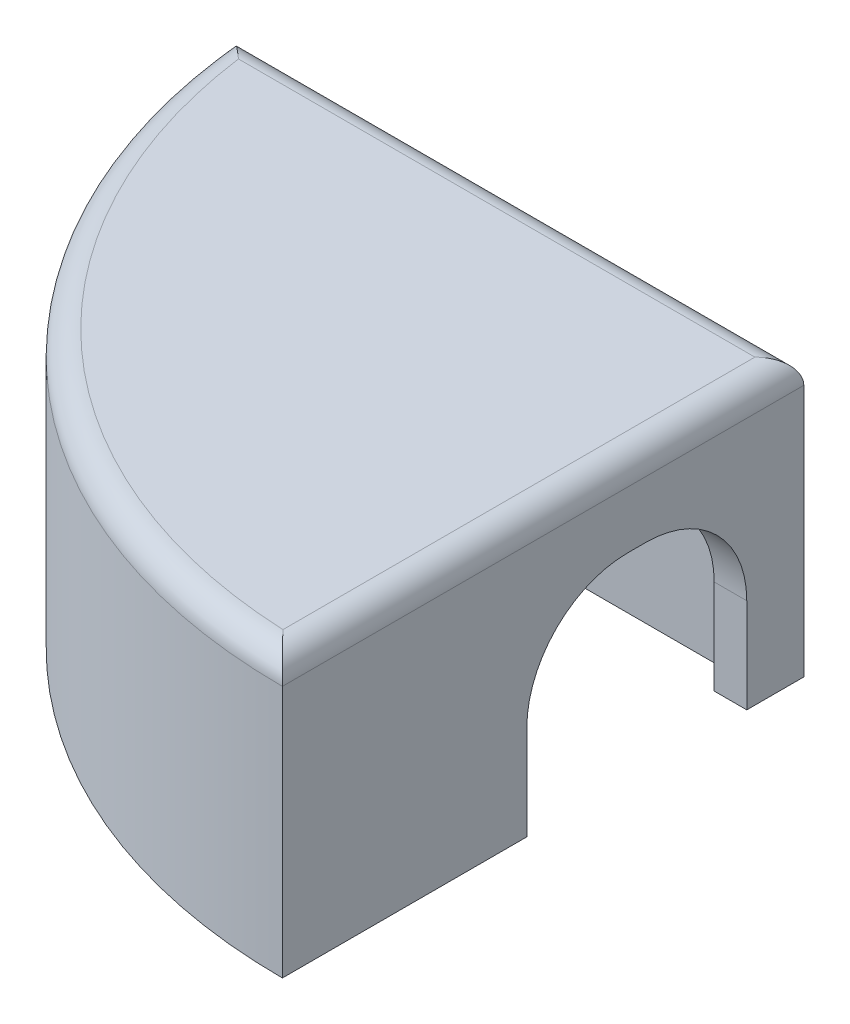
ISO-10303-21;
HEADER;
FILE_DESCRIPTION(('STEP AP214'),'2;1');
FILE_NAME('part.step','',(''),(''),'','','');
FILE_SCHEMA(('AUTOMOTIVE_DESIGN { 1 0 10303 214 1 1 1 1 }'));
ENDSEC;
DATA;
#1=APPLICATION_CONTEXT('core data for automotive mechanical design processes');
#2=APPLICATION_PROTOCOL_DEFINITION('international standard','automotive_design',2000,#1);
#3=PRODUCT_CONTEXT('',#1,'mechanical');
#4=PRODUCT('Part','Part','',(#3));
#5=PRODUCT_RELATED_PRODUCT_CATEGORY('part','',(#4));
#6=PRODUCT_DEFINITION_FORMATION('','',#4);
#7=PRODUCT_DEFINITION_CONTEXT('part definition',#1,'design');
#8=PRODUCT_DEFINITION('design','',#6,#7);
#9=PRODUCT_DEFINITION_SHAPE('','',#8);
#10=(LENGTH_UNIT() NAMED_UNIT(*) SI_UNIT(.MILLI.,.METRE.));
#11=(NAMED_UNIT(*) PLANE_ANGLE_UNIT() SI_UNIT($,.RADIAN.));
#12=(NAMED_UNIT(*) SI_UNIT($,.STERADIAN.) SOLID_ANGLE_UNIT());
#13=UNCERTAINTY_MEASURE_WITH_UNIT(LENGTH_MEASURE(1.E-05),#10,'distance_accuracy_value','');
#14=(GEOMETRIC_REPRESENTATION_CONTEXT(3) GLOBAL_UNCERTAINTY_ASSIGNED_CONTEXT((#13)) GLOBAL_UNIT_ASSIGNED_CONTEXT((#10,
#11,#12)) REPRESENTATION_CONTEXT('',''));
#15=CARTESIAN_POINT('',(0.,0.,0.));
#16=DIRECTION('',(0.,0.,1.));
#17=DIRECTION('',(1.,0.,0.));
#18=AXIS2_PLACEMENT_3D('',#15,#16,#17);
#19=CARTESIAN_POINT('',(-60.,0.,0.));
#20=DIRECTION('',(0.,1.,0.));
#21=DIRECTION('',(0.,0.,1.));
#22=AXIS2_PLACEMENT_3D('',#19,#20,#21);
#23=PLANE('',#22);
#24=DIRECTION('',(0.,0.,-1.));
#25=VECTOR('',#24,1.);
#26=CARTESIAN_POINT('',(-60.,0.,35.));
#27=LINE('',#26,#25);
#28=CARTESIAN_POINT('',(-60.,0.,6.5));
#29=VERTEX_POINT('',#28);
#30=CARTESIAN_POINT('',(-60.,0.,3.));
#31=VERTEX_POINT('',#30);
#32=EDGE_CURVE('E158',#29,#31,#27,.T.);
#33=ORIENTED_EDGE('',*,*,#32,.F.);
#34=DIRECTION('',(1.,0.,0.));
#35=VECTOR('',#34,1.);
#36=CARTESIAN_POINT('',(-65.,0.,6.5));
#37=LINE('',#36,#35);
#38=CARTESIAN_POINT('',(-62.,0.,6.5));
#39=VERTEX_POINT('',#38);
#40=EDGE_CURVE('E151',#39,#29,#37,.T.);
#41=ORIENTED_EDGE('',*,*,#40,.F.);
#42=DIRECTION('',(0.,0.,-1.));
#43=VECTOR('',#42,1.);
#44=CARTESIAN_POINT('',(-62.,0.,5.00000000000001));
#45=LINE('',#44,#43);
#46=CARTESIAN_POINT('',(-62.,0.,5.00000000000001));
#47=VERTEX_POINT('',#46);
#48=EDGE_CURVE('E262',#39,#47,#45,.T.);
#49=ORIENTED_EDGE('',*,*,#48,.T.);
#50=DIRECTION('',(-1.,0.,0.));
#51=VECTOR('',#50,1.);
#52=CARTESIAN_POINT('',(-62.,0.,5.00000000000001));
#53=LINE('',#52,#51);
#54=CARTESIAN_POINT('',(-93.1247641501038,0.,5.00000000000001));
#55=VERTEX_POINT('',#54);
#56=EDGE_CURVE('E297',#47,#55,#53,.T.);
#57=ORIENTED_EDGE('',*,*,#56,.T.);
#58=CARTESIAN_POINT('',(-60.,0.,0.));
#59=DIRECTION('',(0.,1.,0.));
#60=DIRECTION('',(0.,0.,1.));
#61=AXIS2_PLACEMENT_3D('',#58,#59,#60);
#62=CIRCLE('',#61,33.5);
#63=CARTESIAN_POINT('',(-62.,0.,33.4402452144119));
#64=VERTEX_POINT('',#63);
#65=EDGE_CURVE('E261',#55,#64,#62,.T.);
#66=ORIENTED_EDGE('',*,*,#65,.T.);
#67=CARTESIAN_POINT('',(-62.,0.,20.));
#68=VERTEX_POINT('',#67);
#69=EDGE_CURVE('E150',#64,#68,#45,.T.);
#70=ORIENTED_EDGE('',*,*,#69,.T.);
#71=DIRECTION('',(1.,0.,0.));
#72=VECTOR('',#71,1.);
#73=CARTESIAN_POINT('',(-65.,0.,20.));
#74=LINE('',#73,#72);
#75=CARTESIAN_POINT('',(-60.,0.,20.));
#76=VERTEX_POINT('',#75);
#77=EDGE_CURVE('E135',#68,#76,#74,.T.);
#78=ORIENTED_EDGE('',*,*,#77,.T.);
#79=CARTESIAN_POINT('',(-60.,0.,35.));
#80=VERTEX_POINT('',#79);
#81=EDGE_CURVE('E148',#80,#76,#27,.T.);
#82=ORIENTED_EDGE('',*,*,#81,.F.);
#83=CARTESIAN_POINT('',(-60.,0.,0.));
#84=DIRECTION('',(0.,1.,0.));
#85=DIRECTION('',(0.,0.,1.));
#86=AXIS2_PLACEMENT_3D('',#83,#84,#85);
#87=CIRCLE('',#86,35.);
#88=CARTESIAN_POINT('',(-94.8711915483254,0.,3.));
#89=VERTEX_POINT('',#88);
#90=EDGE_CURVE('E161',#89,#80,#87,.T.);
#91=ORIENTED_EDGE('',*,*,#90,.F.);
#92=DIRECTION('',(-1.,0.,0.));
#93=VECTOR('',#92,1.);
#94=CARTESIAN_POINT('',(-60.,0.,3.));
#95=LINE('',#94,#93);
#96=EDGE_CURVE('E157',#31,#89,#95,.T.);
#97=ORIENTED_EDGE('',*,*,#96,.F.);
#98=EDGE_LOOP('',(#33,#41,#49,#57,#66,#70,#78,#82,#91,#97));
#99=FACE_BOUND('',#98,.T.);
#100=ADVANCED_FACE('F34',(#99),#23,.F.);
#101=CARTESIAN_POINT('',(-60.,15.,35.));
#102=DIRECTION('',(-1.,0.,0.));
#103=DIRECTION('',(0.,0.,1.));
#104=AXIS2_PLACEMENT_3D('',#101,#102,#103);
#105=PLANE('',#104);
#106=DIRECTION('',(0.,0.,1.));
#107=VECTOR('',#106,1.);
#108=CARTESIAN_POINT('',(-60.,12.,0.));
#109=LINE('',#108,#107);
#110=CARTESIAN_POINT('',(-60.,12.,12.7));
#111=VERTEX_POINT('',#110);
#112=CARTESIAN_POINT('',(-60.,12.,13.8));
#113=VERTEX_POINT('',#112);
#114=EDGE_CURVE('E141',#111,#113,#109,.T.);
#115=ORIENTED_EDGE('',*,*,#114,.F.);
#116=CARTESIAN_POINT('',(-60.,5.8,12.7));
#117=DIRECTION('',(-1.,0.,0.));
#118=DIRECTION('',(0.,0.,1.));
#119=AXIS2_PLACEMENT_3D('',#116,#117,#118);
#120=CIRCLE('',#119,6.2);
#121=CARTESIAN_POINT('',(-60.,5.8,6.5));
#122=VERTEX_POINT('',#121);
#123=EDGE_CURVE('E42',#111,#122,#120,.T.);
#124=ORIENTED_EDGE('',*,*,#123,.T.);
#125=DIRECTION('',(0.,1.,0.));
#126=VECTOR('',#125,1.);
#127=CARTESIAN_POINT('',(-60.,0.,6.5));
#128=LINE('',#127,#126);
#129=EDGE_CURVE('E140',#29,#122,#128,.T.);
#130=ORIENTED_EDGE('',*,*,#129,.F.);
#131=ORIENTED_EDGE('',*,*,#32,.T.);
#132=DIRECTION('',(0.,-1.,0.));
#133=VECTOR('',#132,1.);
#134=CARTESIAN_POINT('',(-60.,15.,3.));
#135=LINE('',#134,#133);
#136=CARTESIAN_POINT('',(-60.,15.5,3.));
#137=VERTEX_POINT('',#136);
#138=EDGE_CURVE('E171',#137,#31,#135,.T.);
#139=ORIENTED_EDGE('',*,*,#138,.F.);
#140=DIRECTION('',(0.,0.,-1.));
#141=VECTOR('',#140,1.);
#142=CARTESIAN_POINT('',(-60.,15.5,35.));
#143=LINE('',#142,#141);
#144=CARTESIAN_POINT('',(-60.,15.5,35.));
#145=VERTEX_POINT('',#144);
#146=EDGE_CURVE('E186',#137,#145,#143,.F.);
#147=ORIENTED_EDGE('',*,*,#146,.T.);
#148=DIRECTION('',(0.,-1.,0.));
#149=VECTOR('',#148,1.);
#150=CARTESIAN_POINT('',(-60.,15.,35.));
#151=LINE('',#150,#149);
#152=EDGE_CURVE('E155',#145,#80,#151,.T.);
#153=ORIENTED_EDGE('',*,*,#152,.T.);
#154=ORIENTED_EDGE('',*,*,#81,.T.);
#155=DIRECTION('',(0.,-1.,0.));
#156=VECTOR('',#155,1.);
#157=CARTESIAN_POINT('',(-60.,0.,20.));
#158=LINE('',#157,#156);
#159=CARTESIAN_POINT('',(-60.,5.8,20.));
#160=VERTEX_POINT('',#159);
#161=EDGE_CURVE('E131',#160,#76,#158,.T.);
#162=ORIENTED_EDGE('',*,*,#161,.F.);
#163=CARTESIAN_POINT('',(-60.,5.8,13.8));
#164=DIRECTION('',(-1.,0.,0.));
#165=DIRECTION('',(0.,0.,1.));
#166=AXIS2_PLACEMENT_3D('',#163,#164,#165);
#167=CIRCLE('',#166,6.2);
#168=EDGE_CURVE('E278',#160,#113,#167,.T.);
#169=ORIENTED_EDGE('',*,*,#168,.T.);
#170=EDGE_LOOP('',(#115,#124,#130,#131,#139,#147,#153,#154,#162,#169));
#171=FACE_BOUND('',#170,.T.);
#172=ADVANCED_FACE('F153',(#171),#105,.F.);
#173=CARTESIAN_POINT('',(-60.,15.,3.));
#174=DIRECTION('',(0.,0.,1.));
#175=DIRECTION('',(1.,0.,0.));
#176=AXIS2_PLACEMENT_3D('',#173,#174,#175);
#177=PLANE('',#176);
#178=DIRECTION('',(0.,-1.,0.));
#179=VECTOR('',#178,1.);
#180=CARTESIAN_POINT('',(-94.8711915483254,15.,3.));
#181=LINE('',#180,#179);
#182=CARTESIAN_POINT('',(-94.8711915483254,15.5,3.));
#183=VERTEX_POINT('',#182);
#184=EDGE_CURVE('E169',#183,#89,#181,.T.);
#185=ORIENTED_EDGE('',*,*,#184,.F.);
#186=DIRECTION('',(-1.,0.,0.));
#187=VECTOR('',#186,1.);
#188=CARTESIAN_POINT('',(-60.,15.5,3.));
#189=LINE('',#188,#187);
#190=EDGE_CURVE('E184',#183,#137,#189,.F.);
#191=ORIENTED_EDGE('',*,*,#190,.T.);
#192=ORIENTED_EDGE('',*,*,#138,.T.);
#193=ORIENTED_EDGE('',*,*,#96,.T.);
#194=EDGE_LOOP('',(#185,#191,#192,#193));
#195=FACE_BOUND('',#194,.T.);
#196=ADVANCED_FACE('F232',(#195),#177,.F.);
#197=CARTESIAN_POINT('',(-60.,15.,0.));
#198=DIRECTION('',(0.,-1.,0.));
#199=DIRECTION('',(0.,0.,-1.));
#200=AXIS2_PLACEMENT_3D('',#197,#198,#199);
#201=CYLINDRICAL_SURFACE('',#200,35.);
#202=ORIENTED_EDGE('',*,*,#152,.F.);
#203=CARTESIAN_POINT('',(-60.,15.5,0.));
#204=DIRECTION('',(0.,1.,0.));
#205=DIRECTION('',(0.,0.,1.));
#206=AXIS2_PLACEMENT_3D('',#203,#204,#205);
#207=CIRCLE('',#206,35.);
#208=EDGE_CURVE('E181',#145,#183,#207,.F.);
#209=ORIENTED_EDGE('',*,*,#208,.T.);
#210=ORIENTED_EDGE('',*,*,#184,.T.);
#211=ORIENTED_EDGE('',*,*,#90,.T.);
#212=EDGE_LOOP('',(#202,#209,#210,#211));
#213=FACE_BOUND('',#212,.T.);
#214=ADVANCED_FACE('F237',(#213),#201,.T.);
#215=CARTESIAN_POINT('',(-60.,15.,0.));
#216=DIRECTION('',(0.,-1.,0.));
#217=DIRECTION('',(0.,0.,-1.));
#218=AXIS2_PLACEMENT_3D('',#215,#216,#217);
#219=CYLINDRICAL_SURFACE('',#218,33.5);
#220=ORIENTED_EDGE('',*,*,#65,.F.);
#221=DIRECTION('',(0.,-1.,0.));
#222=VECTOR('',#221,1.);
#223=CARTESIAN_POINT('',(-93.1247641501038,15.,5.00000000000001));
#224=LINE('',#223,#222);
#225=CARTESIAN_POINT('',(-93.1247641501038,15.,5.00000000000001));
#226=VERTEX_POINT('',#225);
#227=EDGE_CURVE('E302',#226,#55,#224,.T.);
#228=ORIENTED_EDGE('',*,*,#227,.F.);
#229=CARTESIAN_POINT('',(-60.,15.,0.));
#230=DIRECTION('',(0.,1.,0.));
#231=DIRECTION('',(0.,0.,1.));
#232=AXIS2_PLACEMENT_3D('',#229,#230,#231);
#233=CIRCLE('',#232,33.5);
#234=CARTESIAN_POINT('',(-62.,15.,33.4402452144119));
#235=VERTEX_POINT('',#234);
#236=EDGE_CURVE('E293',#226,#235,#233,.T.);
#237=ORIENTED_EDGE('',*,*,#236,.T.);
#238=DIRECTION('',(0.,-1.,0.));
#239=VECTOR('',#238,1.);
#240=CARTESIAN_POINT('',(-62.,15.,33.4402452144119));
#241=LINE('',#240,#239);
#242=EDGE_CURVE('E163',#235,#64,#241,.T.);
#243=ORIENTED_EDGE('',*,*,#242,.T.);
#244=EDGE_LOOP('',(#220,#228,#237,#243));
#245=FACE_BOUND('',#244,.T.);
#246=ADVANCED_FACE('F235',(#245),#219,.F.);
#247=CARTESIAN_POINT('',(-62.,15.,5.00000000000001));
#248=DIRECTION('',(-1.,0.,0.));
#249=DIRECTION('',(0.,0.,1.));
#250=AXIS2_PLACEMENT_3D('',#247,#248,#249);
#251=PLANE('',#250);
#252=DIRECTION('',(0.,-1.,0.));
#253=VECTOR('',#252,1.);
#254=CARTESIAN_POINT('',(-62.,15.,6.5));
#255=LINE('',#254,#253);
#256=CARTESIAN_POINT('',(-62.,5.8,6.5));
#257=VERTEX_POINT('',#256);
#258=EDGE_CURVE('E269',#257,#39,#255,.T.);
#259=ORIENTED_EDGE('',*,*,#258,.F.);
#260=CARTESIAN_POINT('',(-62.,5.8,12.7));
#261=DIRECTION('',(-1.,0.,0.));
#262=DIRECTION('',(0.,0.,1.));
#263=AXIS2_PLACEMENT_3D('',#260,#261,#262);
#264=CIRCLE('',#263,6.2);
#265=CARTESIAN_POINT('',(-62.,12.,12.7));
#266=VERTEX_POINT('',#265);
#267=EDGE_CURVE('E11',#257,#266,#264,.F.);
#268=ORIENTED_EDGE('',*,*,#267,.T.);
#269=DIRECTION('',(0.,0.,-1.));
#270=VECTOR('',#269,1.);
#271=CARTESIAN_POINT('',(-62.,12.,5.00000000000001));
#272=LINE('',#271,#270);
#273=CARTESIAN_POINT('',(-62.,12.,13.8));
#274=VERTEX_POINT('',#273);
#275=EDGE_CURVE('E266',#274,#266,#272,.T.);
#276=ORIENTED_EDGE('',*,*,#275,.F.);
#277=CARTESIAN_POINT('',(-62.,5.8,13.8));
#278=DIRECTION('',(-1.,0.,0.));
#279=DIRECTION('',(0.,0.,1.));
#280=AXIS2_PLACEMENT_3D('',#277,#278,#279);
#281=CIRCLE('',#280,6.2);
#282=CARTESIAN_POINT('',(-62.,5.8,20.));
#283=VERTEX_POINT('',#282);
#284=EDGE_CURVE('E280',#274,#283,#281,.F.);
#285=ORIENTED_EDGE('',*,*,#284,.T.);
#286=DIRECTION('',(0.,1.,0.));
#287=VECTOR('',#286,1.);
#288=CARTESIAN_POINT('',(-62.,15.,20.));
#289=LINE('',#288,#287);
#290=EDGE_CURVE('E188',#68,#283,#289,.T.);
#291=ORIENTED_EDGE('',*,*,#290,.F.);
#292=ORIENTED_EDGE('',*,*,#69,.F.);
#293=ORIENTED_EDGE('',*,*,#242,.F.);
#294=DIRECTION('',(0.,0.,-1.));
#295=VECTOR('',#294,1.);
#296=CARTESIAN_POINT('',(-62.,15.,5.00000000000001));
#297=LINE('',#296,#295);
#298=CARTESIAN_POINT('',(-62.,15.,5.00000000000001));
#299=VERTEX_POINT('',#298);
#300=EDGE_CURVE('E296',#235,#299,#297,.T.);
#301=ORIENTED_EDGE('',*,*,#300,.T.);
#302=DIRECTION('',(0.,-1.,0.));
#303=VECTOR('',#302,1.);
#304=CARTESIAN_POINT('',(-62.,15.,5.00000000000001));
#305=LINE('',#304,#303);
#306=EDGE_CURVE('E308',#299,#47,#305,.T.);
#307=ORIENTED_EDGE('',*,*,#306,.T.);
#308=ORIENTED_EDGE('',*,*,#48,.F.);
#309=EDGE_LOOP('',(#259,#268,#276,#285,#291,#292,#293,#301,#307,#308));
#310=FACE_BOUND('',#309,.T.);
#311=ADVANCED_FACE('F283',(#310),#251,.T.);
#312=CARTESIAN_POINT('',(-62.,15.,5.00000000000001));
#313=DIRECTION('',(0.,0.,1.));
#314=DIRECTION('',(1.,0.,0.));
#315=AXIS2_PLACEMENT_3D('',#312,#313,#314);
#316=PLANE('',#315);
#317=ORIENTED_EDGE('',*,*,#56,.F.);
#318=ORIENTED_EDGE('',*,*,#306,.F.);
#319=DIRECTION('',(-1.,0.,0.));
#320=VECTOR('',#319,1.);
#321=CARTESIAN_POINT('',(-62.,15.,5.00000000000001));
#322=LINE('',#321,#320);
#323=EDGE_CURVE('E300',#299,#226,#322,.T.);
#324=ORIENTED_EDGE('',*,*,#323,.T.);
#325=ORIENTED_EDGE('',*,*,#227,.T.);
#326=EDGE_LOOP('',(#317,#318,#324,#325));
#327=FACE_BOUND('',#326,.T.);
#328=ADVANCED_FACE('F319',(#327),#316,.T.);
#329=CARTESIAN_POINT('',(-60.,15.,0.));
#330=DIRECTION('',(0.,1.,0.));
#331=DIRECTION('',(0.,0.,1.));
#332=AXIS2_PLACEMENT_3D('',#329,#330,#331);
#333=PLANE('',#332);
#334=ORIENTED_EDGE('',*,*,#300,.F.);
#335=ORIENTED_EDGE('',*,*,#236,.F.);
#336=ORIENTED_EDGE('',*,*,#323,.F.);
#337=EDGE_LOOP('',(#334,#335,#336));
#338=FACE_BOUND('',#337,.T.);
#339=ADVANCED_FACE('F321',(#338),#333,.F.);
#340=CARTESIAN_POINT('',(-60.,17.,0.));
#341=DIRECTION('',(0.,1.,0.));
#342=DIRECTION('',(0.,0.,1.));
#343=AXIS2_PLACEMENT_3D('',#340,#341,#342);
#344=PLANE('',#343);
#345=DIRECTION('',(-1.,0.,0.));
#346=VECTOR('',#345,1.);
#347=CARTESIAN_POINT('',(-94.8711915483254,17.,4.5));
#348=LINE('',#347,#346);
#349=CARTESIAN_POINT('',(-61.5,17.,4.5));
#350=VERTEX_POINT('',#349);
#351=CARTESIAN_POINT('',(-93.1963853453957,17.,4.5));
#352=VERTEX_POINT('',#351);
#353=EDGE_CURVE('E176',#350,#352,#348,.T.);
#354=ORIENTED_EDGE('',*,*,#353,.T.);
#355=CARTESIAN_POINT('',(-60.,17.,0.));
#356=DIRECTION('',(0.,1.,0.));
#357=DIRECTION('',(0.,0.,1.));
#358=AXIS2_PLACEMENT_3D('',#355,#356,#357);
#359=CIRCLE('',#358,33.5);
#360=CARTESIAN_POINT('',(-61.5,17.,33.466401061363));
#361=VERTEX_POINT('',#360);
#362=EDGE_CURVE('E178',#352,#361,#359,.T.);
#363=ORIENTED_EDGE('',*,*,#362,.T.);
#364=DIRECTION('',(0.,0.,-1.));
#365=VECTOR('',#364,1.);
#366=CARTESIAN_POINT('',(-61.5,17.,3.));
#367=LINE('',#366,#365);
#368=EDGE_CURVE('E174',#361,#350,#367,.T.);
#369=ORIENTED_EDGE('',*,*,#368,.T.);
#370=EDGE_LOOP('',(#354,#363,#369));
#371=FACE_BOUND('',#370,.T.);
#372=ADVANCED_FACE('F214',(#371),#344,.T.);
#373=CARTESIAN_POINT('',(-60.,15.5,4.5));
#374=DIRECTION('',(1.,0.,0.));
#375=DIRECTION('',(0.,0.,-1.));
#376=AXIS2_PLACEMENT_3D('',#373,#374,#375);
#377=CYLINDRICAL_SURFACE('',#376,1.5);
#378=CARTESIAN_POINT('',(-94.8711915483254,15.5,3.));
#379=CARTESIAN_POINT('',(-94.87120073599,15.532736084563,2.99999135070511));
#380=CARTESIAN_POINT('',(-94.8700240714627,15.5654651794674,3.0010713458762));
#381=CARTESIAN_POINT('',(-94.8653699372918,15.6305927608825,3.00534195970308));
#382=CARTESIAN_POINT('',(-94.8618944859373,15.6629915121138,3.00853072689851));
#383=CARTESIAN_POINT('',(-94.852755955142,15.7269029314117,3.01691344352494));
#384=CARTESIAN_POINT('',(-94.8471134294665,15.7584210262795,3.02208855308142));
#385=CARTESIAN_POINT('',(-94.8337653738507,15.8206379118948,3.034326770599));
#386=CARTESIAN_POINT('',(-94.8260595086795,15.851336568616,3.04139018535298));
#387=CARTESIAN_POINT('',(-94.8001187328133,15.9416881842016,3.06515835289805));
#388=CARTESIAN_POINT('',(-94.7790201430477,15.9998673310335,3.08447823433033));
#389=CARTESIAN_POINT('',(-94.7304905938561,16.1112288997386,3.12886332564918));
#390=CARTESIAN_POINT('',(-94.7030440211245,16.1643985389827,3.15394270031714));
#391=CARTESIAN_POINT('',(-94.6298287689894,16.2876316965108,3.22074754206168));
#392=CARTESIAN_POINT('',(-94.5813297152446,16.3547449340889,3.26492546635438));
#393=CARTESIAN_POINT('',(-94.4769790913941,16.4776884259273,3.35974548700409));
#394=CARTESIAN_POINT('',(-94.4211129509082,16.5334957499973,3.41040038711607));
#395=CARTESIAN_POINT('',(-94.2777619303822,16.6574773818492,3.54002897267737));
#396=CARTESIAN_POINT('',(-94.1874227078882,16.7197922978535,3.62143186737932));
#397=CARTESIAN_POINT('',(-94.0003238063874,16.8246578301022,3.78929987911141));
#398=CARTESIAN_POINT('',(-93.9035542293729,16.8671771308321,3.87577277495499));
#399=CARTESIAN_POINT('',(-93.7068841475124,16.9341809187849,4.05073132205192));
#400=CARTESIAN_POINT('',(-93.6070050251229,16.9587684445351,4.13920241324351));
#401=CARTESIAN_POINT('',(-93.405534634324,16.9915057706214,4.31684711614857));
#402=CARTESIAN_POINT('',(-93.3039471873598,16.99968832977,4.40601897011893));
#403=CARTESIAN_POINT('',(-93.2002919877285,16.9999970812693,4.49658705010679));
#404=CARTESIAN_POINT('',(-93.1983386847077,16.9999999928479,4.49829358495712));
#405=CARTESIAN_POINT('',(-93.1963853453957,17.,4.5));
#406=B_SPLINE_CURVE_WITH_KNOTS('',3,(#378,#379,#380,#381,#382,#383,#384,#385,#386,#387,#388,
#389,#390,#391,#392,#393,#394,#395,#396,#397,#398,#399,#400,#401,#402,#403,#404,#405),
.UNSPECIFIED.,.F.,.F.,(4,2,2,2,2,2,2,2,2,2,2,2,2,4),(0.,0.0981579696019494,0.19622987265093,
0.293393703143607,0.390573329444304,0.584115702935848,0.778139267151613,1.05811386133227,
1.33865072580236,1.74634032322146,2.15467268866185,2.56063982326496,2.96579547798538,
2.97357679133061),.UNSPECIFIED.);
#407=EDGE_CURVE('E197',#352,#183,#406,.F.);
#408=ORIENTED_EDGE('',*,*,#407,.F.);
#409=ORIENTED_EDGE('',*,*,#353,.F.);
#410=CARTESIAN_POINT('',(-61.5,15.5,4.5));
#411=DIRECTION('',(0.707106781186547,0.,0.707106781186547));
#412=DIRECTION('',(-0.707106781186547,0.,0.707106781186547));
#413=AXIS2_PLACEMENT_3D('',#410,#411,#412);
#414=ELLIPSE('',#413,2.12132034355964,1.5);
#415=EDGE_CURVE('E258',#137,#350,#414,.T.);
#416=ORIENTED_EDGE('',*,*,#415,.F.);
#417=ORIENTED_EDGE('',*,*,#190,.F.);
#418=EDGE_LOOP('',(#408,#409,#416,#417));
#419=FACE_BOUND('',#418,.T.);
#420=ADVANCED_FACE('F210',(#419),#377,.T.);
#421=CARTESIAN_POINT('',(-61.5,15.5,0.));
#422=DIRECTION('',(0.,0.,1.));
#423=DIRECTION('',(1.,0.,0.));
#424=AXIS2_PLACEMENT_3D('',#421,#422,#423);
#425=CYLINDRICAL_SURFACE('',#424,1.5);
#426=ORIENTED_EDGE('',*,*,#415,.T.);
#427=ORIENTED_EDGE('',*,*,#368,.F.);
#428=CARTESIAN_POINT('',(-60.,15.5,35.));
#429=CARTESIAN_POINT('',(-59.9999916557432,15.5335761737281,35.000008122591));
#430=CARTESIAN_POINT('',(-60.0011270746831,15.5671460322196,34.9988729206648));
#431=CARTESIAN_POINT('',(-60.0056212372299,15.6339617563277,34.9943784421329));
#432=CARTESIAN_POINT('',(-60.0089782814373,15.6672078498945,34.9910208654995));
#433=CARTESIAN_POINT('',(-60.017814491133,15.7328406922236,34.9821812326027));
#434=CARTESIAN_POINT('',(-60.023275636735,15.7652323077143,34.9767172160269));
#435=CARTESIAN_POINT('',(-60.0362050067775,15.829196758375,34.9637768479264));
#436=CARTESIAN_POINT('',(-60.0436735089641,15.8607694795761,34.9563002179282));
#437=CARTESIAN_POINT('',(-60.0688444575993,15.9537600132596,34.9310917450952));
#438=CARTESIAN_POINT('',(-60.0893469118016,16.0136961192591,34.9105467914775));
#439=CARTESIAN_POINT('',(-60.1365761447453,16.1284497554637,34.8631643903237));
#440=CARTESIAN_POINT('',(-60.1633166666653,16.1832556040181,34.8363130481918));
#441=CARTESIAN_POINT('',(-60.2335517404598,16.3081461637847,34.765688040143));
#442=CARTESIAN_POINT('',(-60.2794554729792,16.3754885461838,34.719455372791));
#443=CARTESIAN_POINT('',(-60.3781391466786,16.4988479042823,34.6198318556321));
#444=CARTESIAN_POINT('',(-60.4309319453512,16.5548431904713,34.566427615512));
#445=CARTESIAN_POINT('',(-60.563047235427,16.6760213211838,34.4324374751573));
#446=CARTESIAN_POINT('',(-60.6446097440635,16.7360914728681,34.3494494060955));
#447=CARTESIAN_POINT('',(-60.8129858296578,16.8370367069484,34.1774549451035));
#448=CARTESIAN_POINT('',(-60.8998062751631,16.8778860425093,34.0884406623155));
#449=CARTESIAN_POINT('',(-61.07108103632,16.9400842361008,33.9121167037526));
#450=CARTESIAN_POINT('',(-61.1553868595407,16.9624144228405,33.8250005099494));
#451=CARTESIAN_POINT('',(-61.3247611516425,16.9922012817855,33.6492855440658));
#452=CARTESIAN_POINT('',(-61.4098277426219,16.9996878183016,33.5606901112125));
#453=CARTESIAN_POINT('',(-61.4964293682218,16.9999968078128,33.4701351621068));
#454=CARTESIAN_POINT('',(-61.4982147429416,16.9999999947312,33.4682681288125));
#455=CARTESIAN_POINT('',(-61.5,17.,33.466401061363));
#456=B_SPLINE_CURVE_WITH_KNOTS('',3,(#428,#429,#430,#431,#432,#433,#434,#435,#436,#437,#438,
#439,#440,#441,#442,#443,#444,#445,#446,#447,#448,#449,#450,#451,#452,#453,#454,#455),
.UNSPECIFIED.,.F.,.F.,(4,2,2,2,2,2,2,2,2,2,2,2,2,4),(0.,0.100679868984729,0.201282813271958,
0.301042669622394,0.400816336265205,0.599621607266899,0.798869075961352,1.07840463637869,
1.35846957962932,1.74920102938187,2.14045439548842,2.50933983988027,2.87748235826606,
2.88523221821119),.UNSPECIFIED.);
#457=EDGE_CURVE('E189',#145,#361,#456,.T.);
#458=ORIENTED_EDGE('',*,*,#457,.F.);
#459=ORIENTED_EDGE('',*,*,#146,.F.);
#460=EDGE_LOOP('',(#426,#427,#458,#459));
#461=FACE_BOUND('',#460,.T.);
#462=ADVANCED_FACE('F207',(#461),#425,.T.);
#463=CARTESIAN_POINT('',(-60.,15.5,0.));
#464=DIRECTION('',(0.,1.,0.));
#465=DIRECTION('',(0.,0.,1.));
#466=AXIS2_PLACEMENT_3D('',#463,#464,#465);
#467=TOROIDAL_SURFACE('',#466,33.5,1.5);
#468=ORIENTED_EDGE('',*,*,#407,.T.);
#469=ORIENTED_EDGE('',*,*,#208,.F.);
#470=ORIENTED_EDGE('',*,*,#457,.T.);
#471=ORIENTED_EDGE('',*,*,#362,.F.);
#472=EDGE_LOOP('',(#468,#469,#470,#471));
#473=FACE_BOUND('',#472,.T.);
#474=ADVANCED_FACE('F204',(#473),#467,.T.);
#475=CARTESIAN_POINT('',(-65.,12.,0.));
#476=DIRECTION('',(0.,1.,0.));
#477=DIRECTION('',(0.,0.,1.));
#478=AXIS2_PLACEMENT_3D('',#475,#476,#477);
#479=PLANE('',#478);
#480=ORIENTED_EDGE('',*,*,#114,.T.);
#481=DIRECTION('',(1.,0.,0.));
#482=VECTOR('',#481,1.);
#483=CARTESIAN_POINT('',(-62.,12.,13.8));
#484=LINE('',#483,#482);
#485=EDGE_CURVE('E275',#113,#274,#484,.F.);
#486=ORIENTED_EDGE('',*,*,#485,.T.);
#487=ORIENTED_EDGE('',*,*,#275,.T.);
#488=DIRECTION('',(1.,0.,0.));
#489=VECTOR('',#488,1.);
#490=CARTESIAN_POINT('',(-60.,12.,12.7));
#491=LINE('',#490,#489);
#492=EDGE_CURVE('E272',#266,#111,#491,.T.);
#493=ORIENTED_EDGE('',*,*,#492,.T.);
#494=EDGE_LOOP('',(#480,#486,#487,#493));
#495=FACE_BOUND('',#494,.T.);
#496=ADVANCED_FACE('F287',(#495),#479,.F.);
#497=CARTESIAN_POINT('',(-65.,0.,6.5));
#498=DIRECTION('',(0.,0.,-1.));
#499=DIRECTION('',(-1.,0.,0.));
#500=AXIS2_PLACEMENT_3D('',#497,#498,#499);
#501=PLANE('',#500);
#502=ORIENTED_EDGE('',*,*,#129,.T.);
#503=DIRECTION('',(1.,0.,0.));
#504=VECTOR('',#503,1.);
#505=CARTESIAN_POINT('',(-62.,5.8,6.5));
#506=LINE('',#505,#504);
#507=EDGE_CURVE('E55',#122,#257,#506,.F.);
#508=ORIENTED_EDGE('',*,*,#507,.T.);
#509=ORIENTED_EDGE('',*,*,#258,.T.);
#510=ORIENTED_EDGE('',*,*,#40,.T.);
#511=EDGE_LOOP('',(#502,#508,#509,#510));
#512=FACE_BOUND('',#511,.T.);
#513=ADVANCED_FACE('F224',(#512),#501,.F.);
#514=CARTESIAN_POINT('',(-65.,0.,20.));
#515=DIRECTION('',(0.,0.,1.));
#516=DIRECTION('',(1.,0.,0.));
#517=AXIS2_PLACEMENT_3D('',#514,#515,#516);
#518=PLANE('',#517);
#519=ORIENTED_EDGE('',*,*,#290,.T.);
#520=DIRECTION('',(1.,0.,0.));
#521=VECTOR('',#520,1.);
#522=CARTESIAN_POINT('',(-60.,5.8,20.));
#523=LINE('',#522,#521);
#524=EDGE_CURVE('E138',#283,#160,#523,.T.);
#525=ORIENTED_EDGE('',*,*,#524,.T.);
#526=ORIENTED_EDGE('',*,*,#161,.T.);
#527=ORIENTED_EDGE('',*,*,#77,.F.);
#528=EDGE_LOOP('',(#519,#525,#526,#527));
#529=FACE_BOUND('',#528,.T.);
#530=ADVANCED_FACE('F134',(#529),#518,.F.);
#531=CARTESIAN_POINT('',(-65.,5.8,13.8));
#532=DIRECTION('',(-1.,0.,0.));
#533=DIRECTION('',(0.,0.,1.));
#534=AXIS2_PLACEMENT_3D('',#531,#532,#533);
#535=CYLINDRICAL_SURFACE('',#534,6.2);
#536=ORIENTED_EDGE('',*,*,#284,.F.);
#537=ORIENTED_EDGE('',*,*,#485,.F.);
#538=ORIENTED_EDGE('',*,*,#168,.F.);
#539=ORIENTED_EDGE('',*,*,#524,.F.);
#540=EDGE_LOOP('',(#536,#537,#538,#539));
#541=FACE_BOUND('',#540,.T.);
#542=ADVANCED_FACE('F216',(#541),#535,.F.);
#543=CARTESIAN_POINT('',(-65.,5.8,12.7));
#544=DIRECTION('',(-1.,0.,0.));
#545=DIRECTION('',(0.,0.,1.));
#546=AXIS2_PLACEMENT_3D('',#543,#544,#545);
#547=CYLINDRICAL_SURFACE('',#546,6.2);
#548=ORIENTED_EDGE('',*,*,#267,.F.);
#549=ORIENTED_EDGE('',*,*,#507,.F.);
#550=ORIENTED_EDGE('',*,*,#123,.F.);
#551=ORIENTED_EDGE('',*,*,#492,.F.);
#552=EDGE_LOOP('',(#548,#549,#550,#551));
#553=FACE_BOUND('',#552,.T.);
#554=ADVANCED_FACE('F36',(#553),#547,.F.);
#555=CLOSED_SHELL('',(#100,#172,#196,#214,#246,#311,#328,#339,#372,#420,#462,#474,#496,#513,
#530,#542,#554));
#556=MANIFOLD_SOLID_BREP('B2',#555);
#557=ADVANCED_BREP_SHAPE_REPRESENTATION('',(#18,#556),#14);
#558=SHAPE_DEFINITION_REPRESENTATION(#9,#557);
ENDSEC;
END-ISO-10303-21;
